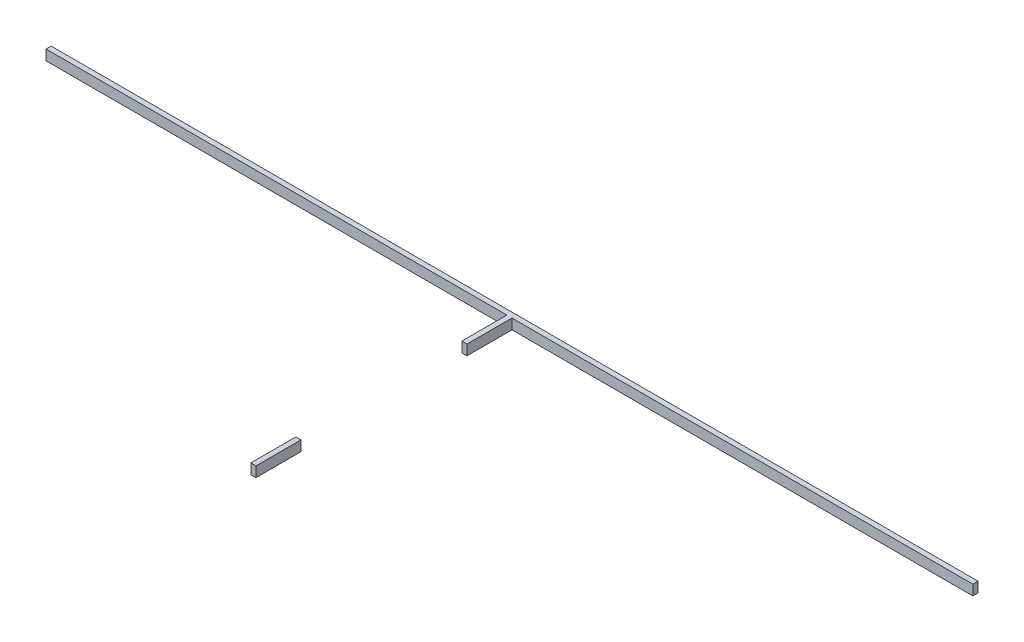
ISO-10303-21;
HEADER;
FILE_DESCRIPTION(('STEP AP214'),'2;1');
FILE_NAME('part.step','',(''),(''),'','','');
FILE_SCHEMA(('AUTOMOTIVE_DESIGN { 1 0 10303 214 1 1 1 1 }'));
ENDSEC;
DATA;
#1=APPLICATION_CONTEXT('core data for automotive mechanical design processes');
#2=APPLICATION_PROTOCOL_DEFINITION('international standard','automotive_design',2000,#1);
#3=PRODUCT_CONTEXT('',#1,'mechanical');
#4=PRODUCT('Part','Part','',(#3));
#5=PRODUCT_RELATED_PRODUCT_CATEGORY('part','',(#4));
#6=PRODUCT_DEFINITION_FORMATION('','',#4);
#7=PRODUCT_DEFINITION_CONTEXT('part definition',#1,'design');
#8=PRODUCT_DEFINITION('design','',#6,#7);
#9=PRODUCT_DEFINITION_SHAPE('','',#8);
#10=(LENGTH_UNIT() NAMED_UNIT(*) SI_UNIT(.MILLI.,.METRE.));
#11=(NAMED_UNIT(*) PLANE_ANGLE_UNIT() SI_UNIT($,.RADIAN.));
#12=(NAMED_UNIT(*) SI_UNIT($,.STERADIAN.) SOLID_ANGLE_UNIT());
#13=UNCERTAINTY_MEASURE_WITH_UNIT(LENGTH_MEASURE(1.E-05),#10,'distance_accuracy_value','');
#14=(GEOMETRIC_REPRESENTATION_CONTEXT(3) GLOBAL_UNCERTAINTY_ASSIGNED_CONTEXT((#13)) GLOBAL_UNIT_ASSIGNED_CONTEXT((#10,
#11,#12)) REPRESENTATION_CONTEXT('',''));
#15=CARTESIAN_POINT('',(0.,0.,0.));
#16=DIRECTION('',(0.,0.,1.));
#17=DIRECTION('',(1.,0.,0.));
#18=AXIS2_PLACEMENT_3D('',#15,#16,#17);
#19=CARTESIAN_POINT('',(-25.0000000000001,100.,2110.));
#20=DIRECTION('',(1.,0.,0.));
#21=DIRECTION('',(0.,0.,-1.));
#22=AXIS2_PLACEMENT_3D('',#19,#20,#21);
#23=PLANE('',#22);
#24=DIRECTION('',(0.,0.,1.));
#25=VECTOR('',#24,1.);
#26=CARTESIAN_POINT('',(-25.0000000000001,0.,2110.));
#27=LINE('',#26,#25);
#28=CARTESIAN_POINT('',(-25.0000000000001,0.,2110.));
#29=VERTEX_POINT('',#28);
#30=CARTESIAN_POINT('',(-25.,0.,2550.));
#31=VERTEX_POINT('',#30);
#32=EDGE_CURVE('E12',#29,#31,#27,.T.);
#33=ORIENTED_EDGE('',*,*,#32,.T.);
#34=DIRECTION('',(0.,-1.,0.));
#35=VECTOR('',#34,1.);
#36=CARTESIAN_POINT('',(-25.,100.,2550.));
#37=LINE('',#36,#35);
#38=CARTESIAN_POINT('',(-25.,100.,2550.));
#39=VERTEX_POINT('',#38);
#40=EDGE_CURVE('E125',#39,#31,#37,.T.);
#41=ORIENTED_EDGE('',*,*,#40,.F.);
#42=DIRECTION('',(0.,0.,1.));
#43=VECTOR('',#42,1.);
#44=CARTESIAN_POINT('',(-25.0000000000001,100.,2110.));
#45=LINE('',#44,#43);
#46=CARTESIAN_POINT('',(-25.0000000000001,100.,2110.));
#47=VERTEX_POINT('',#46);
#48=EDGE_CURVE('E54',#47,#39,#45,.T.);
#49=ORIENTED_EDGE('',*,*,#48,.F.);
#50=DIRECTION('',(0.,-1.,0.));
#51=VECTOR('',#50,1.);
#52=CARTESIAN_POINT('',(-25.0000000000001,100.,2110.));
#53=LINE('',#52,#51);
#54=EDGE_CURVE('E109',#47,#29,#53,.T.);
#55=ORIENTED_EDGE('',*,*,#54,.T.);
#56=EDGE_LOOP('',(#33,#41,#49,#55));
#57=FACE_BOUND('',#56,.T.);
#58=ADVANCED_FACE('F51',(#57),#23,.F.);
#59=CARTESIAN_POINT('',(-25.,100.,2550.));
#60=DIRECTION('',(0.,0.,-1.));
#61=DIRECTION('',(-1.,0.,0.));
#62=AXIS2_PLACEMENT_3D('',#59,#60,#61);
#63=PLANE('',#62);
#64=DIRECTION('',(1.,0.,0.));
#65=VECTOR('',#64,1.);
#66=CARTESIAN_POINT('',(-25.,0.,2550.));
#67=LINE('',#66,#65);
#68=CARTESIAN_POINT('',(25.,0.,2550.));
#69=VERTEX_POINT('',#68);
#70=EDGE_CURVE('E61',#31,#69,#67,.T.);
#71=ORIENTED_EDGE('',*,*,#70,.T.);
#72=DIRECTION('',(0.,-1.,0.));
#73=VECTOR('',#72,1.);
#74=CARTESIAN_POINT('',(25.,100.,2550.));
#75=LINE('',#74,#73);
#76=CARTESIAN_POINT('',(25.,100.,2550.));
#77=VERTEX_POINT('',#76);
#78=EDGE_CURVE('E106',#77,#69,#75,.T.);
#79=ORIENTED_EDGE('',*,*,#78,.F.);
#80=DIRECTION('',(1.,0.,0.));
#81=VECTOR('',#80,1.);
#82=CARTESIAN_POINT('',(-25.,100.,2550.));
#83=LINE('',#82,#81);
#84=EDGE_CURVE('E84',#39,#77,#83,.T.);
#85=ORIENTED_EDGE('',*,*,#84,.F.);
#86=ORIENTED_EDGE('',*,*,#40,.T.);
#87=EDGE_LOOP('',(#71,#79,#85,#86));
#88=FACE_BOUND('',#87,.T.);
#89=ADVANCED_FACE('F124',(#88),#63,.F.);
#90=CARTESIAN_POINT('',(24.9999999999999,100.,2110.));
#91=DIRECTION('',(-1.,0.,0.));
#92=DIRECTION('',(0.,0.,1.));
#93=AXIS2_PLACEMENT_3D('',#90,#91,#92);
#94=PLANE('',#93);
#95=DIRECTION('',(0.,0.,-1.));
#96=VECTOR('',#95,1.);
#97=CARTESIAN_POINT('',(24.9999999999999,0.,2110.));
#98=LINE('',#97,#96);
#99=CARTESIAN_POINT('',(24.9999999999999,0.,2110.));
#100=VERTEX_POINT('',#99);
#101=EDGE_CURVE('E101',#69,#100,#98,.T.);
#102=ORIENTED_EDGE('',*,*,#101,.T.);
#103=DIRECTION('',(0.,-1.,0.));
#104=VECTOR('',#103,1.);
#105=CARTESIAN_POINT('',(24.9999999999999,100.,2110.));
#106=LINE('',#105,#104);
#107=CARTESIAN_POINT('',(24.9999999999999,100.,2110.));
#108=VERTEX_POINT('',#107);
#109=EDGE_CURVE('E102',#108,#100,#106,.T.);
#110=ORIENTED_EDGE('',*,*,#109,.F.);
#111=DIRECTION('',(0.,0.,-1.));
#112=VECTOR('',#111,1.);
#113=CARTESIAN_POINT('',(24.9999999999999,100.,2110.));
#114=LINE('',#113,#112);
#115=EDGE_CURVE('E117',#77,#108,#114,.T.);
#116=ORIENTED_EDGE('',*,*,#115,.F.);
#117=ORIENTED_EDGE('',*,*,#78,.T.);
#118=EDGE_LOOP('',(#102,#110,#116,#117));
#119=FACE_BOUND('',#118,.T.);
#120=ADVANCED_FACE('F105',(#119),#94,.F.);
#121=CARTESIAN_POINT('',(-25.0000000000001,100.,2110.));
#122=DIRECTION('',(0.,0.,1.));
#123=DIRECTION('',(1.,0.,0.));
#124=AXIS2_PLACEMENT_3D('',#121,#122,#123);
#125=PLANE('',#124);
#126=DIRECTION('',(-1.,0.,0.));
#127=VECTOR('',#126,1.);
#128=CARTESIAN_POINT('',(-25.0000000000001,0.,2110.));
#129=LINE('',#128,#127);
#130=EDGE_CURVE('E92',#100,#29,#129,.T.);
#131=ORIENTED_EDGE('',*,*,#130,.T.);
#132=ORIENTED_EDGE('',*,*,#54,.F.);
#133=DIRECTION('',(-1.,0.,0.));
#134=VECTOR('',#133,1.);
#135=CARTESIAN_POINT('',(-25.0000000000001,100.,2110.));
#136=LINE('',#135,#134);
#137=EDGE_CURVE('E108',#108,#47,#136,.T.);
#138=ORIENTED_EDGE('',*,*,#137,.F.);
#139=ORIENTED_EDGE('',*,*,#109,.T.);
#140=EDGE_LOOP('',(#131,#132,#138,#139));
#141=FACE_BOUND('',#140,.T.);
#142=ADVANCED_FACE('F107',(#141),#125,.F.);
#143=CARTESIAN_POINT('',(0.,100.,0.));
#144=DIRECTION('',(0.,1.,0.));
#145=DIRECTION('',(0.,0.,1.));
#146=AXIS2_PLACEMENT_3D('',#143,#144,#145);
#147=PLANE('',#146);
#148=ORIENTED_EDGE('',*,*,#48,.T.);
#149=ORIENTED_EDGE('',*,*,#84,.T.);
#150=ORIENTED_EDGE('',*,*,#115,.T.);
#151=ORIENTED_EDGE('',*,*,#137,.T.);
#152=EDGE_LOOP('',(#148,#149,#150,#151));
#153=FACE_BOUND('',#152,.T.);
#154=ADVANCED_FACE('F52',(#153),#147,.T.);
#155=CARTESIAN_POINT('',(0.,0.,0.));
#156=DIRECTION('',(0.,1.,0.));
#157=DIRECTION('',(0.,0.,1.));
#158=AXIS2_PLACEMENT_3D('',#155,#156,#157);
#159=PLANE('',#158);
#160=ORIENTED_EDGE('',*,*,#32,.F.);
#161=ORIENTED_EDGE('',*,*,#130,.F.);
#162=ORIENTED_EDGE('',*,*,#101,.F.);
#163=ORIENTED_EDGE('',*,*,#70,.F.);
#164=EDGE_LOOP('',(#160,#161,#162,#163));
#165=FACE_BOUND('',#164,.T.);
#166=ADVANCED_FACE('F115',(#165),#159,.F.);
#167=CLOSED_SHELL('',(#58,#89,#120,#142,#154,#166));
#168=MANIFOLD_SOLID_BREP('B2',#167);
#169=CARTESIAN_POINT('',(-4525.,100.,50.));
#170=DIRECTION('',(1.,0.,0.));
#171=DIRECTION('',(0.,0.,-1.));
#172=AXIS2_PLACEMENT_3D('',#169,#170,#171);
#173=PLANE('',#172);
#174=DIRECTION('',(0.,0.,1.));
#175=VECTOR('',#174,1.);
#176=CARTESIAN_POINT('',(-4525.,0.,50.));
#177=LINE('',#176,#175);
#178=CARTESIAN_POINT('',(-4525.,0.,0.));
#179=VERTEX_POINT('',#178);
#180=CARTESIAN_POINT('',(-4525.,0.,50.));
#181=VERTEX_POINT('',#180);
#182=EDGE_CURVE('E271',#179,#181,#177,.T.);
#183=ORIENTED_EDGE('',*,*,#182,.T.);
#184=DIRECTION('',(0.,-1.,0.));
#185=VECTOR('',#184,1.);
#186=CARTESIAN_POINT('',(-4525.,100.,50.));
#187=LINE('',#186,#185);
#188=CARTESIAN_POINT('',(-4525.,100.,50.));
#189=VERTEX_POINT('',#188);
#190=EDGE_CURVE('E47',#189,#181,#187,.T.);
#191=ORIENTED_EDGE('',*,*,#190,.F.);
#192=DIRECTION('',(0.,0.,1.));
#193=VECTOR('',#192,1.);
#194=CARTESIAN_POINT('',(-4525.,100.,50.));
#195=LINE('',#194,#193);
#196=CARTESIAN_POINT('',(-4525.,100.,0.));
#197=VERTEX_POINT('',#196);
#198=EDGE_CURVE('E284',#197,#189,#195,.T.);
#199=ORIENTED_EDGE('',*,*,#198,.F.);
#200=DIRECTION('',(0.,-1.,0.));
#201=VECTOR('',#200,1.);
#202=CARTESIAN_POINT('',(-4525.,100.,0.));
#203=LINE('',#202,#201);
#204=EDGE_CURVE('E270',#197,#179,#203,.T.);
#205=ORIENTED_EDGE('',*,*,#204,.T.);
#206=EDGE_LOOP('',(#183,#191,#199,#205));
#207=FACE_BOUND('',#206,.T.);
#208=ADVANCED_FACE('F174',(#207),#173,.F.);
#209=CARTESIAN_POINT('',(-25.,100.,49.9999999999995));
#210=DIRECTION('',(0.,0.,-1.));
#211=DIRECTION('',(-1.,0.,0.));
#212=AXIS2_PLACEMENT_3D('',#209,#210,#211);
#213=PLANE('',#212);
#214=DIRECTION('',(1.,0.,0.));
#215=VECTOR('',#214,1.);
#216=CARTESIAN_POINT('',(-25.,0.,49.9999999999995));
#217=LINE('',#216,#215);
#218=CARTESIAN_POINT('',(-25.,0.,49.9999999999995));
#219=VERTEX_POINT('',#218);
#220=EDGE_CURVE('E273',#181,#219,#217,.T.);
#221=ORIENTED_EDGE('',*,*,#220,.T.);
#222=DIRECTION('',(0.,-1.,0.));
#223=VECTOR('',#222,1.);
#224=CARTESIAN_POINT('',(-25.,100.,49.9999999999995));
#225=LINE('',#224,#223);
#226=CARTESIAN_POINT('',(-25.,100.,49.9999999999995));
#227=VERTEX_POINT('',#226);
#228=EDGE_CURVE('E181',#227,#219,#225,.T.);
#229=ORIENTED_EDGE('',*,*,#228,.F.);
#230=DIRECTION('',(1.,0.,0.));
#231=VECTOR('',#230,1.);
#232=CARTESIAN_POINT('',(-25.,100.,49.9999999999995));
#233=LINE('',#232,#231);
#234=EDGE_CURVE('E232',#189,#227,#233,.T.);
#235=ORIENTED_EDGE('',*,*,#234,.F.);
#236=ORIENTED_EDGE('',*,*,#190,.T.);
#237=EDGE_LOOP('',(#221,#229,#235,#236));
#238=FACE_BOUND('',#237,.T.);
#239=ADVANCED_FACE('F319',(#238),#213,.F.);
#240=CARTESIAN_POINT('',(-25.,100.,489.999999999999));
#241=DIRECTION('',(1.,0.,0.));
#242=DIRECTION('',(0.,0.,-1.));
#243=AXIS2_PLACEMENT_3D('',#240,#241,#242);
#244=PLANE('',#243);
#245=DIRECTION('',(0.,0.,1.));
#246=VECTOR('',#245,1.);
#247=CARTESIAN_POINT('',(-25.,0.,489.999999999999));
#248=LINE('',#247,#246);
#249=CARTESIAN_POINT('',(-25.,0.,489.999999999999));
#250=VERTEX_POINT('',#249);
#251=EDGE_CURVE('E277',#219,#250,#248,.T.);
#252=ORIENTED_EDGE('',*,*,#251,.T.);
#253=DIRECTION('',(0.,-1.,0.));
#254=VECTOR('',#253,1.);
#255=CARTESIAN_POINT('',(-25.,100.,489.999999999999));
#256=LINE('',#255,#254);
#257=CARTESIAN_POINT('',(-25.,100.,489.999999999999));
#258=VERTEX_POINT('',#257);
#259=EDGE_CURVE('E295',#258,#250,#256,.T.);
#260=ORIENTED_EDGE('',*,*,#259,.F.);
#261=DIRECTION('',(0.,0.,1.));
#262=VECTOR('',#261,1.);
#263=CARTESIAN_POINT('',(-25.,100.,489.999999999999));
#264=LINE('',#263,#262);
#265=EDGE_CURVE('E299',#227,#258,#264,.T.);
#266=ORIENTED_EDGE('',*,*,#265,.F.);
#267=ORIENTED_EDGE('',*,*,#228,.T.);
#268=EDGE_LOOP('',(#252,#260,#266,#267));
#269=FACE_BOUND('',#268,.T.);
#270=ADVANCED_FACE('F297',(#269),#244,.F.);
#271=CARTESIAN_POINT('',(24.9999999999998,100.,489.999999999999));
#272=DIRECTION('',(0.,0.,-1.));
#273=DIRECTION('',(-1.,0.,0.));
#274=AXIS2_PLACEMENT_3D('',#271,#272,#273);
#275=PLANE('',#274);
#276=DIRECTION('',(1.,0.,0.));
#277=VECTOR('',#276,1.);
#278=CARTESIAN_POINT('',(24.9999999999998,0.,489.999999999999));
#279=LINE('',#278,#277);
#280=CARTESIAN_POINT('',(24.9999999999998,0.,489.999999999999));
#281=VERTEX_POINT('',#280);
#282=EDGE_CURVE('E279',#250,#281,#279,.T.);
#283=ORIENTED_EDGE('',*,*,#282,.T.);
#284=DIRECTION('',(0.,-1.,0.));
#285=VECTOR('',#284,1.);
#286=CARTESIAN_POINT('',(24.9999999999998,100.,489.999999999999));
#287=LINE('',#286,#285);
#288=CARTESIAN_POINT('',(24.9999999999998,100.,489.999999999999));
#289=VERTEX_POINT('',#288);
#290=EDGE_CURVE('E287',#289,#281,#287,.T.);
#291=ORIENTED_EDGE('',*,*,#290,.F.);
#292=DIRECTION('',(1.,0.,0.));
#293=VECTOR('',#292,1.);
#294=CARTESIAN_POINT('',(24.9999999999998,100.,489.999999999999));
#295=LINE('',#294,#293);
#296=EDGE_CURVE('E315',#258,#289,#295,.T.);
#297=ORIENTED_EDGE('',*,*,#296,.F.);
#298=ORIENTED_EDGE('',*,*,#259,.T.);
#299=EDGE_LOOP('',(#283,#291,#297,#298));
#300=FACE_BOUND('',#299,.T.);
#301=ADVANCED_FACE('F306',(#300),#275,.F.);
#302=CARTESIAN_POINT('',(24.9999999999997,100.,49.999999999999));
#303=DIRECTION('',(-1.,0.,0.));
#304=DIRECTION('',(0.,0.,1.));
#305=AXIS2_PLACEMENT_3D('',#302,#303,#304);
#306=PLANE('',#305);
#307=DIRECTION('',(0.,0.,-1.));
#308=VECTOR('',#307,1.);
#309=CARTESIAN_POINT('',(24.9999999999997,0.,49.999999999999));
#310=LINE('',#309,#308);
#311=CARTESIAN_POINT('',(24.9999999999997,0.,49.999999999999));
#312=VERTEX_POINT('',#311);
#313=EDGE_CURVE('E278',#281,#312,#310,.T.);
#314=ORIENTED_EDGE('',*,*,#313,.T.);
#315=DIRECTION('',(0.,-1.,0.));
#316=VECTOR('',#315,1.);
#317=CARTESIAN_POINT('',(24.9999999999997,100.,49.999999999999));
#318=LINE('',#317,#316);
#319=CARTESIAN_POINT('',(24.9999999999997,100.,49.999999999999));
#320=VERTEX_POINT('',#319);
#321=EDGE_CURVE('E265',#320,#312,#318,.T.);
#322=ORIENTED_EDGE('',*,*,#321,.F.);
#323=DIRECTION('',(0.,0.,-1.));
#324=VECTOR('',#323,1.);
#325=CARTESIAN_POINT('',(24.9999999999997,100.,49.999999999999));
#326=LINE('',#325,#324);
#327=EDGE_CURVE('E251',#289,#320,#326,.T.);
#328=ORIENTED_EDGE('',*,*,#327,.F.);
#329=ORIENTED_EDGE('',*,*,#290,.T.);
#330=EDGE_LOOP('',(#314,#322,#328,#329));
#331=FACE_BOUND('',#330,.T.);
#332=ADVANCED_FACE('F313',(#331),#306,.F.);
#333=CARTESIAN_POINT('',(4525.,100.,49.9999999999984));
#334=DIRECTION('',(0.,0.,-1.));
#335=DIRECTION('',(-1.,0.,0.));
#336=AXIS2_PLACEMENT_3D('',#333,#334,#335);
#337=PLANE('',#336);
#338=DIRECTION('',(1.,0.,0.));
#339=VECTOR('',#338,1.);
#340=CARTESIAN_POINT('',(4525.,0.,49.9999999999984));
#341=LINE('',#340,#339);
#342=CARTESIAN_POINT('',(4525.,0.,49.9999999999984));
#343=VERTEX_POINT('',#342);
#344=EDGE_CURVE('E261',#312,#343,#341,.T.);
#345=ORIENTED_EDGE('',*,*,#344,.T.);
#346=DIRECTION('',(0.,-1.,0.));
#347=VECTOR('',#346,1.);
#348=CARTESIAN_POINT('',(4525.,100.,49.9999999999984));
#349=LINE('',#348,#347);
#350=CARTESIAN_POINT('',(4525.,100.,49.9999999999984));
#351=VERTEX_POINT('',#350);
#352=EDGE_CURVE('E256',#351,#343,#349,.T.);
#353=ORIENTED_EDGE('',*,*,#352,.F.);
#354=DIRECTION('',(1.,0.,0.));
#355=VECTOR('',#354,1.);
#356=CARTESIAN_POINT('',(4525.,100.,49.9999999999984));
#357=LINE('',#356,#355);
#358=EDGE_CURVE('E250',#320,#351,#357,.T.);
#359=ORIENTED_EDGE('',*,*,#358,.F.);
#360=ORIENTED_EDGE('',*,*,#321,.T.);
#361=EDGE_LOOP('',(#345,#353,#359,#360));
#362=FACE_BOUND('',#361,.T.);
#363=ADVANCED_FACE('F259',(#362),#337,.F.);
#364=CARTESIAN_POINT('',(4525.,100.,0.));
#365=DIRECTION('',(-1.,0.,0.));
#366=DIRECTION('',(0.,0.,1.));
#367=AXIS2_PLACEMENT_3D('',#364,#365,#366);
#368=PLANE('',#367);
#369=DIRECTION('',(0.,0.,-1.));
#370=VECTOR('',#369,1.);
#371=CARTESIAN_POINT('',(4525.,0.,0.));
#372=LINE('',#371,#370);
#373=CARTESIAN_POINT('',(4525.,0.,0.));
#374=VERTEX_POINT('',#373);
#375=EDGE_CURVE('E219',#343,#374,#372,.T.);
#376=ORIENTED_EDGE('',*,*,#375,.T.);
#377=DIRECTION('',(0.,-1.,0.));
#378=VECTOR('',#377,1.);
#379=CARTESIAN_POINT('',(4525.,100.,0.));
#380=LINE('',#379,#378);
#381=CARTESIAN_POINT('',(4525.,100.,0.));
#382=VERTEX_POINT('',#381);
#383=EDGE_CURVE('E263',#382,#374,#380,.T.);
#384=ORIENTED_EDGE('',*,*,#383,.F.);
#385=DIRECTION('',(0.,0.,-1.));
#386=VECTOR('',#385,1.);
#387=CARTESIAN_POINT('',(4525.,100.,0.));
#388=LINE('',#387,#386);
#389=EDGE_CURVE('E253',#351,#382,#388,.T.);
#390=ORIENTED_EDGE('',*,*,#389,.F.);
#391=ORIENTED_EDGE('',*,*,#352,.T.);
#392=EDGE_LOOP('',(#376,#384,#390,#391));
#393=FACE_BOUND('',#392,.T.);
#394=ADVANCED_FACE('F264',(#393),#368,.F.);
#395=CARTESIAN_POINT('',(-4525.,100.,0.));
#396=DIRECTION('',(0.,0.,1.));
#397=DIRECTION('',(1.,0.,0.));
#398=AXIS2_PLACEMENT_3D('',#395,#396,#397);
#399=PLANE('',#398);
#400=DIRECTION('',(-1.,0.,0.));
#401=VECTOR('',#400,1.);
#402=CARTESIAN_POINT('',(-4525.,0.,0.));
#403=LINE('',#402,#401);
#404=EDGE_CURVE('E226',#374,#179,#403,.T.);
#405=ORIENTED_EDGE('',*,*,#404,.T.);
#406=ORIENTED_EDGE('',*,*,#204,.F.);
#407=DIRECTION('',(-1.,0.,0.));
#408=VECTOR('',#407,1.);
#409=CARTESIAN_POINT('',(-4525.,100.,0.));
#410=LINE('',#409,#408);
#411=EDGE_CURVE('E193',#382,#197,#410,.T.);
#412=ORIENTED_EDGE('',*,*,#411,.F.);
#413=ORIENTED_EDGE('',*,*,#383,.T.);
#414=EDGE_LOOP('',(#405,#406,#412,#413));
#415=FACE_BOUND('',#414,.T.);
#416=ADVANCED_FACE('F336',(#415),#399,.F.);
#417=CARTESIAN_POINT('',(0.,100.,0.));
#418=DIRECTION('',(0.,-1.,0.));
#419=DIRECTION('',(0.,0.,-1.));
#420=AXIS2_PLACEMENT_3D('',#417,#418,#419);
#421=PLANE('',#420);
#422=ORIENTED_EDGE('',*,*,#198,.T.);
#423=ORIENTED_EDGE('',*,*,#234,.T.);
#424=ORIENTED_EDGE('',*,*,#265,.T.);
#425=ORIENTED_EDGE('',*,*,#296,.T.);
#426=ORIENTED_EDGE('',*,*,#327,.T.);
#427=ORIENTED_EDGE('',*,*,#358,.T.);
#428=ORIENTED_EDGE('',*,*,#389,.T.);
#429=ORIENTED_EDGE('',*,*,#411,.T.);
#430=EDGE_LOOP('',(#422,#423,#424,#425,#426,#427,#428,#429));
#431=FACE_BOUND('',#430,.T.);
#432=ADVANCED_FACE('F247',(#431),#421,.F.);
#433=CARTESIAN_POINT('',(0.,0.,0.));
#434=DIRECTION('',(0.,-1.,0.));
#435=DIRECTION('',(0.,0.,-1.));
#436=AXIS2_PLACEMENT_3D('',#433,#434,#435);
#437=PLANE('',#436);
#438=ORIENTED_EDGE('',*,*,#182,.F.);
#439=ORIENTED_EDGE('',*,*,#404,.F.);
#440=ORIENTED_EDGE('',*,*,#375,.F.);
#441=ORIENTED_EDGE('',*,*,#344,.F.);
#442=ORIENTED_EDGE('',*,*,#313,.F.);
#443=ORIENTED_EDGE('',*,*,#282,.F.);
#444=ORIENTED_EDGE('',*,*,#251,.F.);
#445=ORIENTED_EDGE('',*,*,#220,.F.);
#446=EDGE_LOOP('',(#438,#439,#440,#441,#442,#443,#444,#445));
#447=FACE_BOUND('',#446,.T.);
#448=ADVANCED_FACE('F302',(#447),#437,.T.);
#449=CLOSED_SHELL('',(#208,#239,#270,#301,#332,#363,#394,#416,#432,#448));
#450=MANIFOLD_SOLID_BREP('B6',#449);
#451=ADVANCED_BREP_SHAPE_REPRESENTATION('',(#18,#168,#450),#14);
#452=SHAPE_DEFINITION_REPRESENTATION(#9,#451);
ENDSEC;
END-ISO-10303-21;
